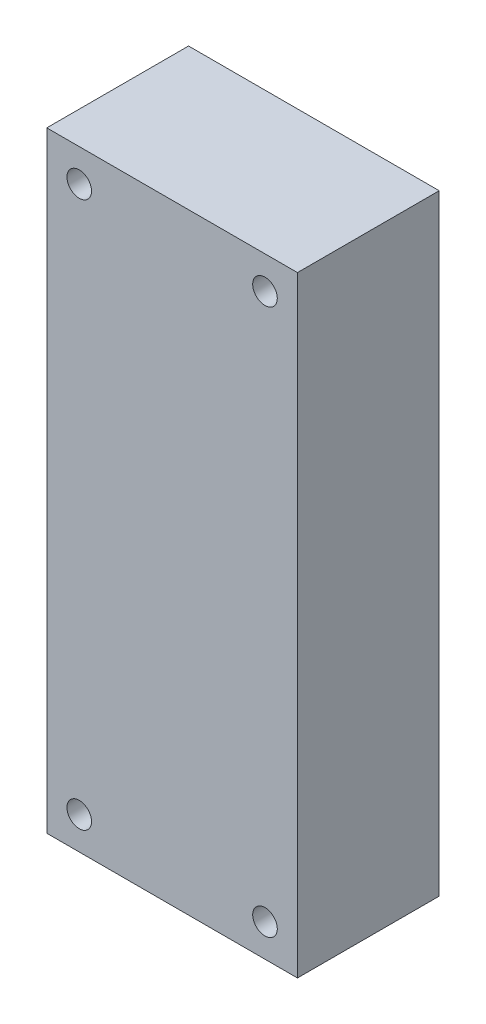
ISO-10303-21;
HEADER;
FILE_DESCRIPTION(('STEP AP214'),'2;1');
FILE_NAME('part.step','',(''),(''),'','','');
FILE_SCHEMA(('AUTOMOTIVE_DESIGN { 1 0 10303 214 1 1 1 1 }'));
ENDSEC;
DATA;
#1=APPLICATION_CONTEXT('core data for automotive mechanical design processes');
#2=APPLICATION_PROTOCOL_DEFINITION('international standard','automotive_design',2000,#1);
#3=PRODUCT_CONTEXT('',#1,'mechanical');
#4=PRODUCT('Part','Part','',(#3));
#5=PRODUCT_RELATED_PRODUCT_CATEGORY('part','',(#4));
#6=PRODUCT_DEFINITION_FORMATION('','',#4);
#7=PRODUCT_DEFINITION_CONTEXT('part definition',#1,'design');
#8=PRODUCT_DEFINITION('design','',#6,#7);
#9=PRODUCT_DEFINITION_SHAPE('','',#8);
#10=(LENGTH_UNIT() NAMED_UNIT(*) SI_UNIT(.MILLI.,.METRE.));
#11=(NAMED_UNIT(*) PLANE_ANGLE_UNIT() SI_UNIT($,.RADIAN.));
#12=(NAMED_UNIT(*) SI_UNIT($,.STERADIAN.) SOLID_ANGLE_UNIT());
#13=UNCERTAINTY_MEASURE_WITH_UNIT(LENGTH_MEASURE(1.E-05),#10,'distance_accuracy_value','');
#14=(GEOMETRIC_REPRESENTATION_CONTEXT(3) GLOBAL_UNCERTAINTY_ASSIGNED_CONTEXT((#13)) GLOBAL_UNIT_ASSIGNED_CONTEXT((#10,
#11,#12)) REPRESENTATION_CONTEXT('',''));
#15=CARTESIAN_POINT('',(0.,0.,0.));
#16=DIRECTION('',(0.,0.,1.));
#17=DIRECTION('',(1.,0.,0.));
#18=AXIS2_PLACEMENT_3D('',#15,#16,#17);
#19=CARTESIAN_POINT('',(0.,0.,14.41));
#20=DIRECTION('',(0.,0.,1.));
#21=DIRECTION('',(1.,0.,0.));
#22=AXIS2_PLACEMENT_3D('',#19,#20,#21);
#23=PLANE('',#22);
#24=CARTESIAN_POINT('',(9.44,-27.75,14.41));
#25=DIRECTION('',(0.,0.,1.));
#26=DIRECTION('',(-1.,0.,0.));
#27=AXIS2_PLACEMENT_3D('',#24,#25,#26);
#28=CIRCLE('',#27,1.25);
#29=CARTESIAN_POINT('',(8.19,-27.75,14.41));
#30=VERTEX_POINT('',#29);
#31=EDGE_CURVE('E146',#30,#30,#28,.T.);
#32=ORIENTED_EDGE('',*,*,#31,.F.);
#33=EDGE_LOOP('',(#32));
#34=FACE_BOUND('',#33,.T.);
#35=CARTESIAN_POINT('',(9.44,27.75,14.41));
#36=DIRECTION('',(0.,0.,1.));
#37=DIRECTION('',(1.,0.,0.));
#38=AXIS2_PLACEMENT_3D('',#35,#36,#37);
#39=CIRCLE('',#38,1.25);
#40=CARTESIAN_POINT('',(10.69,27.75,14.41));
#41=VERTEX_POINT('',#40);
#42=EDGE_CURVE('E116',#41,#41,#39,.T.);
#43=ORIENTED_EDGE('',*,*,#42,.F.);
#44=EDGE_LOOP('',(#43));
#45=FACE_BOUND('',#44,.T.);
#46=DIRECTION('',(0.,-1.,0.));
#47=VECTOR('',#46,1.);
#48=CARTESIAN_POINT('',(-12.74,31.05,14.41));
#49=LINE('',#48,#47);
#50=CARTESIAN_POINT('',(-12.74,31.05,14.41));
#51=VERTEX_POINT('',#50);
#52=CARTESIAN_POINT('',(-12.74,-31.05,14.41));
#53=VERTEX_POINT('',#52);
#54=EDGE_CURVE('E96',#51,#53,#49,.T.);
#55=ORIENTED_EDGE('',*,*,#54,.T.);
#56=DIRECTION('',(1.,0.,0.));
#57=VECTOR('',#56,1.);
#58=CARTESIAN_POINT('',(-12.74,-31.05,14.41));
#59=LINE('',#58,#57);
#60=CARTESIAN_POINT('',(12.74,-31.05,14.41));
#61=VERTEX_POINT('',#60);
#62=EDGE_CURVE('E91',#53,#61,#59,.T.);
#63=ORIENTED_EDGE('',*,*,#62,.T.);
#64=DIRECTION('',(0.,1.,0.));
#65=VECTOR('',#64,1.);
#66=CARTESIAN_POINT('',(12.74,31.05,14.41));
#67=LINE('',#66,#65);
#68=CARTESIAN_POINT('',(12.74,31.05,14.41));
#69=VERTEX_POINT('',#68);
#70=EDGE_CURVE('E94',#61,#69,#67,.T.);
#71=ORIENTED_EDGE('',*,*,#70,.T.);
#72=DIRECTION('',(-1.,0.,0.));
#73=VECTOR('',#72,1.);
#74=CARTESIAN_POINT('',(-12.74,31.05,14.41));
#75=LINE('',#74,#73);
#76=EDGE_CURVE('E61',#69,#51,#75,.T.);
#77=ORIENTED_EDGE('',*,*,#76,.T.);
#78=EDGE_LOOP('',(#55,#63,#71,#77));
#79=FACE_BOUND('',#78,.T.);
#80=CARTESIAN_POINT('',(-9.44,27.75,14.41));
#81=DIRECTION('',(0.,0.,1.));
#82=DIRECTION('',(-1.,0.,0.));
#83=AXIS2_PLACEMENT_3D('',#80,#81,#82);
#84=CIRCLE('',#83,1.25);
#85=CARTESIAN_POINT('',(-10.69,27.75,14.41));
#86=VERTEX_POINT('',#85);
#87=EDGE_CURVE('E138',#86,#86,#84,.T.);
#88=ORIENTED_EDGE('',*,*,#87,.F.);
#89=EDGE_LOOP('',(#88));
#90=FACE_BOUND('',#89,.T.);
#91=CARTESIAN_POINT('',(-9.44,-27.75,14.41));
#92=DIRECTION('',(0.,0.,1.));
#93=DIRECTION('',(1.,0.,0.));
#94=AXIS2_PLACEMENT_3D('',#91,#92,#93);
#95=CIRCLE('',#94,1.25);
#96=CARTESIAN_POINT('',(-8.19,-27.75,14.41));
#97=VERTEX_POINT('',#96);
#98=EDGE_CURVE('E154',#97,#97,#95,.T.);
#99=ORIENTED_EDGE('',*,*,#98,.F.);
#100=EDGE_LOOP('',(#99));
#101=FACE_BOUND('',#100,.T.);
#102=ADVANCED_FACE('F43',(#34,#45,#79,#90,#101),#23,.T.);
#103=CARTESIAN_POINT('',(0.,0.,0.));
#104=DIRECTION('',(0.,0.,1.));
#105=DIRECTION('',(1.,0.,0.));
#106=AXIS2_PLACEMENT_3D('',#103,#104,#105);
#107=PLANE('',#106);
#108=DIRECTION('',(0.,-1.,0.));
#109=VECTOR('',#108,1.);
#110=CARTESIAN_POINT('',(-12.74,31.05,0.));
#111=LINE('',#110,#109);
#112=CARTESIAN_POINT('',(-12.74,31.05,0.));
#113=VERTEX_POINT('',#112);
#114=CARTESIAN_POINT('',(-12.74,-31.05,0.));
#115=VERTEX_POINT('',#114);
#116=EDGE_CURVE('E112',#113,#115,#111,.T.);
#117=ORIENTED_EDGE('',*,*,#116,.F.);
#118=DIRECTION('',(-1.,0.,0.));
#119=VECTOR('',#118,1.);
#120=CARTESIAN_POINT('',(-12.74,31.05,0.));
#121=LINE('',#120,#119);
#122=CARTESIAN_POINT('',(12.74,31.05,0.));
#123=VERTEX_POINT('',#122);
#124=EDGE_CURVE('E84',#123,#113,#121,.T.);
#125=ORIENTED_EDGE('',*,*,#124,.F.);
#126=DIRECTION('',(0.,1.,0.));
#127=VECTOR('',#126,1.);
#128=CARTESIAN_POINT('',(12.74,31.05,0.));
#129=LINE('',#128,#127);
#130=CARTESIAN_POINT('',(12.74,-31.05,0.));
#131=VERTEX_POINT('',#130);
#132=EDGE_CURVE('E78',#131,#123,#129,.T.);
#133=ORIENTED_EDGE('',*,*,#132,.F.);
#134=DIRECTION('',(1.,0.,0.));
#135=VECTOR('',#134,1.);
#136=CARTESIAN_POINT('',(-12.74,-31.05,0.));
#137=LINE('',#136,#135);
#138=EDGE_CURVE('E101',#115,#131,#137,.T.);
#139=ORIENTED_EDGE('',*,*,#138,.F.);
#140=EDGE_LOOP('',(#117,#125,#133,#139));
#141=FACE_BOUND('',#140,.T.);
#142=CARTESIAN_POINT('',(9.44,27.75,0.));
#143=DIRECTION('',(0.,0.,1.));
#144=DIRECTION('',(1.,0.,0.));
#145=AXIS2_PLACEMENT_3D('',#142,#143,#144);
#146=CIRCLE('',#145,1.25);
#147=CARTESIAN_POINT('',(10.69,27.75,0.));
#148=VERTEX_POINT('',#147);
#149=EDGE_CURVE('E134',#148,#148,#146,.T.);
#150=ORIENTED_EDGE('',*,*,#149,.T.);
#151=EDGE_LOOP('',(#150));
#152=FACE_BOUND('',#151,.T.);
#153=CARTESIAN_POINT('',(-9.44,27.75,0.));
#154=DIRECTION('',(0.,0.,1.));
#155=DIRECTION('',(-1.,0.,0.));
#156=AXIS2_PLACEMENT_3D('',#153,#154,#155);
#157=CIRCLE('',#156,1.25);
#158=CARTESIAN_POINT('',(-10.69,27.75,0.));
#159=VERTEX_POINT('',#158);
#160=EDGE_CURVE('E142',#159,#159,#157,.T.);
#161=ORIENTED_EDGE('',*,*,#160,.T.);
#162=EDGE_LOOP('',(#161));
#163=FACE_BOUND('',#162,.T.);
#164=CARTESIAN_POINT('',(9.44,-27.75,0.));
#165=DIRECTION('',(0.,0.,1.));
#166=DIRECTION('',(-1.,0.,0.));
#167=AXIS2_PLACEMENT_3D('',#164,#165,#166);
#168=CIRCLE('',#167,1.25);
#169=CARTESIAN_POINT('',(8.19,-27.75,0.));
#170=VERTEX_POINT('',#169);
#171=EDGE_CURVE('E150',#170,#170,#168,.T.);
#172=ORIENTED_EDGE('',*,*,#171,.T.);
#173=EDGE_LOOP('',(#172));
#174=FACE_BOUND('',#173,.T.);
#175=CARTESIAN_POINT('',(-9.44,-27.75,0.));
#176=DIRECTION('',(0.,0.,1.));
#177=DIRECTION('',(1.,0.,0.));
#178=AXIS2_PLACEMENT_3D('',#175,#176,#177);
#179=CIRCLE('',#178,1.25);
#180=CARTESIAN_POINT('',(-8.19,-27.75,0.));
#181=VERTEX_POINT('',#180);
#182=EDGE_CURVE('E158',#181,#181,#179,.T.);
#183=ORIENTED_EDGE('',*,*,#182,.T.);
#184=EDGE_LOOP('',(#183));
#185=FACE_BOUND('',#184,.T.);
#186=ADVANCED_FACE('F129',(#141,#152,#163,#174,#185),#107,.F.);
#187=CARTESIAN_POINT('',(-12.74,31.05,14.41));
#188=DIRECTION('',(1.,0.,0.));
#189=DIRECTION('',(0.,0.,-1.));
#190=AXIS2_PLACEMENT_3D('',#187,#188,#189);
#191=PLANE('',#190);
#192=ORIENTED_EDGE('',*,*,#116,.T.);
#193=DIRECTION('',(0.,0.,-1.));
#194=VECTOR('',#193,1.);
#195=CARTESIAN_POINT('',(-12.74,-31.05,14.41));
#196=LINE('',#195,#194);
#197=EDGE_CURVE('E11',#53,#115,#196,.T.);
#198=ORIENTED_EDGE('',*,*,#197,.F.);
#199=ORIENTED_EDGE('',*,*,#54,.F.);
#200=DIRECTION('',(0.,0.,-1.));
#201=VECTOR('',#200,1.);
#202=CARTESIAN_POINT('',(-12.74,31.05,14.41));
#203=LINE('',#202,#201);
#204=EDGE_CURVE('E108',#51,#113,#203,.T.);
#205=ORIENTED_EDGE('',*,*,#204,.T.);
#206=EDGE_LOOP('',(#192,#198,#199,#205));
#207=FACE_BOUND('',#206,.T.);
#208=ADVANCED_FACE('F45',(#207),#191,.F.);
#209=CARTESIAN_POINT('',(-12.74,-31.05,14.41));
#210=DIRECTION('',(0.,1.,0.));
#211=DIRECTION('',(0.,0.,1.));
#212=AXIS2_PLACEMENT_3D('',#209,#210,#211);
#213=PLANE('',#212);
#214=ORIENTED_EDGE('',*,*,#138,.T.);
#215=DIRECTION('',(0.,0.,-1.));
#216=VECTOR('',#215,1.);
#217=CARTESIAN_POINT('',(12.74,-31.05,14.41));
#218=LINE('',#217,#216);
#219=EDGE_CURVE('E53',#61,#131,#218,.T.);
#220=ORIENTED_EDGE('',*,*,#219,.F.);
#221=ORIENTED_EDGE('',*,*,#62,.F.);
#222=ORIENTED_EDGE('',*,*,#197,.T.);
#223=EDGE_LOOP('',(#214,#220,#221,#222));
#224=FACE_BOUND('',#223,.T.);
#225=ADVANCED_FACE('F100',(#224),#213,.F.);
#226=CARTESIAN_POINT('',(12.74,31.05,14.41));
#227=DIRECTION('',(-1.,0.,0.));
#228=DIRECTION('',(0.,-1.,0.));
#229=AXIS2_PLACEMENT_3D('',#226,#227,#228);
#230=PLANE('',#229);
#231=ORIENTED_EDGE('',*,*,#132,.T.);
#232=DIRECTION('',(0.,0.,-1.));
#233=VECTOR('',#232,1.);
#234=CARTESIAN_POINT('',(12.74,31.05,14.41));
#235=LINE('',#234,#233);
#236=EDGE_CURVE('E103',#69,#123,#235,.T.);
#237=ORIENTED_EDGE('',*,*,#236,.F.);
#238=ORIENTED_EDGE('',*,*,#70,.F.);
#239=ORIENTED_EDGE('',*,*,#219,.T.);
#240=EDGE_LOOP('',(#231,#237,#238,#239));
#241=FACE_BOUND('',#240,.T.);
#242=ADVANCED_FACE('F104',(#241),#230,.F.);
#243=CARTESIAN_POINT('',(-12.74,31.05,14.41));
#244=DIRECTION('',(0.,-1.,0.));
#245=DIRECTION('',(0.,0.,-1.));
#246=AXIS2_PLACEMENT_3D('',#243,#244,#245);
#247=PLANE('',#246);
#248=ORIENTED_EDGE('',*,*,#124,.T.);
#249=ORIENTED_EDGE('',*,*,#204,.F.);
#250=ORIENTED_EDGE('',*,*,#76,.F.);
#251=ORIENTED_EDGE('',*,*,#236,.T.);
#252=EDGE_LOOP('',(#248,#249,#250,#251));
#253=FACE_BOUND('',#252,.T.);
#254=ADVANCED_FACE('F126',(#253),#247,.F.);
#255=CARTESIAN_POINT('',(9.44,27.75,14.41));
#256=DIRECTION('',(0.,0.,-1.));
#257=DIRECTION('',(-1.,0.,0.));
#258=AXIS2_PLACEMENT_3D('',#255,#256,#257);
#259=CYLINDRICAL_SURFACE('',#258,1.25);
#260=ORIENTED_EDGE('',*,*,#42,.T.);
#261=EDGE_LOOP('',(#260));
#262=FACE_BOUND('',#261,.T.);
#263=ORIENTED_EDGE('',*,*,#149,.F.);
#264=EDGE_LOOP('',(#263));
#265=FACE_BOUND('',#264,.T.);
#266=ADVANCED_FACE('F179',(#262,#265),#259,.F.);
#267=CARTESIAN_POINT('',(-9.44,27.75,14.41));
#268=DIRECTION('',(0.,0.,-1.));
#269=DIRECTION('',(-1.,0.,0.));
#270=AXIS2_PLACEMENT_3D('',#267,#268,#269);
#271=CYLINDRICAL_SURFACE('',#270,1.25);
#272=ORIENTED_EDGE('',*,*,#87,.T.);
#273=EDGE_LOOP('',(#272));
#274=FACE_BOUND('',#273,.T.);
#275=ORIENTED_EDGE('',*,*,#160,.F.);
#276=EDGE_LOOP('',(#275));
#277=FACE_BOUND('',#276,.T.);
#278=ADVANCED_FACE('F233',(#274,#277),#271,.F.);
#279=CARTESIAN_POINT('',(9.44,-27.75,14.41));
#280=DIRECTION('',(0.,0.,-1.));
#281=DIRECTION('',(-1.,0.,0.));
#282=AXIS2_PLACEMENT_3D('',#279,#280,#281);
#283=CYLINDRICAL_SURFACE('',#282,1.25);
#284=ORIENTED_EDGE('',*,*,#31,.T.);
#285=EDGE_LOOP('',(#284));
#286=FACE_BOUND('',#285,.T.);
#287=ORIENTED_EDGE('',*,*,#171,.F.);
#288=EDGE_LOOP('',(#287));
#289=FACE_BOUND('',#288,.T.);
#290=ADVANCED_FACE('F242',(#286,#289),#283,.F.);
#291=CARTESIAN_POINT('',(-9.44,-27.75,14.41));
#292=DIRECTION('',(0.,0.,-1.));
#293=DIRECTION('',(-1.,0.,0.));
#294=AXIS2_PLACEMENT_3D('',#291,#292,#293);
#295=CYLINDRICAL_SURFACE('',#294,1.25);
#296=ORIENTED_EDGE('',*,*,#98,.T.);
#297=EDGE_LOOP('',(#296));
#298=FACE_BOUND('',#297,.T.);
#299=ORIENTED_EDGE('',*,*,#182,.F.);
#300=EDGE_LOOP('',(#299));
#301=FACE_BOUND('',#300,.T.);
#302=ADVANCED_FACE('F166',(#298,#301),#295,.F.);
#303=CLOSED_SHELL('',(#102,#186,#208,#225,#242,#254,#266,#278,#290,#302));
#304=MANIFOLD_SOLID_BREP('B2',#303);
#305=ADVANCED_BREP_SHAPE_REPRESENTATION('',(#18,#304),#14);
#306=SHAPE_DEFINITION_REPRESENTATION(#9,#305);
ENDSEC;
END-ISO-10303-21;
